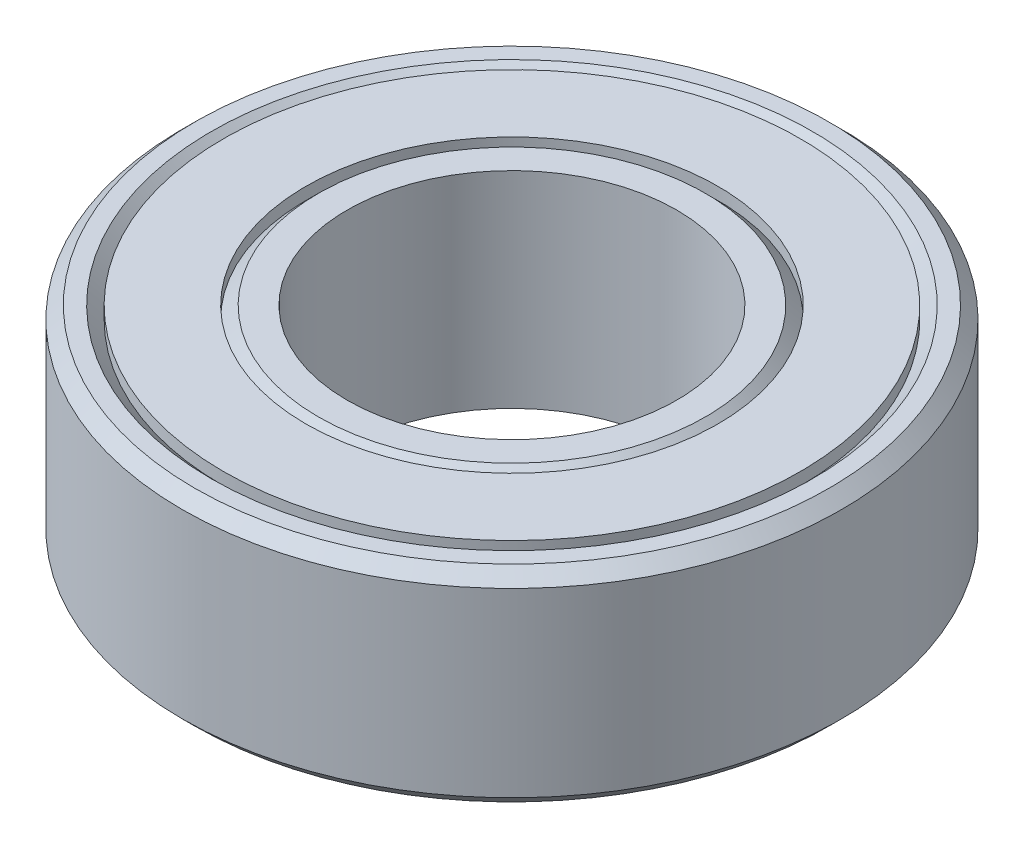
ISO-10303-21;
HEADER;
FILE_DESCRIPTION(('STEP AP214'),'2;1');
FILE_NAME('part.step','',(''),(''),'','','');
FILE_SCHEMA(('AUTOMOTIVE_DESIGN { 1 0 10303 214 1 1 1 1 }'));
ENDSEC;
DATA;
#1=APPLICATION_CONTEXT('core data for automotive mechanical design processes');
#2=APPLICATION_PROTOCOL_DEFINITION('international standard','automotive_design',2000,#1);
#3=PRODUCT_CONTEXT('',#1,'mechanical');
#4=PRODUCT('Part','Part','',(#3));
#5=PRODUCT_RELATED_PRODUCT_CATEGORY('part','',(#4));
#6=PRODUCT_DEFINITION_FORMATION('','',#4);
#7=PRODUCT_DEFINITION_CONTEXT('part definition',#1,'design');
#8=PRODUCT_DEFINITION('design','',#6,#7);
#9=PRODUCT_DEFINITION_SHAPE('','',#8);
#10=(LENGTH_UNIT() NAMED_UNIT(*) SI_UNIT(.MILLI.,.METRE.));
#11=(NAMED_UNIT(*) PLANE_ANGLE_UNIT() SI_UNIT($,.RADIAN.));
#12=(NAMED_UNIT(*) SI_UNIT($,.STERADIAN.) SOLID_ANGLE_UNIT());
#13=UNCERTAINTY_MEASURE_WITH_UNIT(LENGTH_MEASURE(1.E-05),#10,'distance_accuracy_value','');
#14=(GEOMETRIC_REPRESENTATION_CONTEXT(3) GLOBAL_UNCERTAINTY_ASSIGNED_CONTEXT((#13)) GLOBAL_UNIT_ASSIGNED_CONTEXT((#10,
#11,#12)) REPRESENTATION_CONTEXT('',''));
#15=CARTESIAN_POINT('',(0.,0.,0.));
#16=DIRECTION('',(0.,0.,1.));
#17=DIRECTION('',(1.,0.,0.));
#18=AXIS2_PLACEMENT_3D('',#15,#16,#17);
#19=CARTESIAN_POINT('',(0.,5.,0.));
#20=DIRECTION('',(0.,1.,0.));
#21=DIRECTION('',(0.,0.,1.));
#22=AXIS2_PLACEMENT_3D('',#19,#20,#21);
#23=PLANE('',#22);
#24=CARTESIAN_POINT('',(0.,5.,0.));
#25=DIRECTION('',(0.,1.,0.));
#26=DIRECTION('',(0.,0.,1.));
#27=AXIS2_PLACEMENT_3D('',#24,#25,#26);
#28=CIRCLE('',#27,4.7);
#29=CARTESIAN_POINT('',(0.,5.,4.7));
#30=VERTEX_POINT('',#29);
#31=EDGE_CURVE('P0_E10',#30,#30,#28,.T.);
#32=ORIENTED_EDGE('',*,*,#31,.T.);
#33=EDGE_LOOP('',(#32));
#34=FACE_BOUND('',#33,.T.);
#35=CARTESIAN_POINT('',(0.,5.,0.));
#36=DIRECTION('',(0.,1.,0.));
#37=DIRECTION('',(0.,0.,1.));
#38=AXIS2_PLACEMENT_3D('',#35,#36,#37);
#39=CIRCLE('',#38,4.);
#40=CARTESIAN_POINT('',(0.,5.,4.));
#41=VERTEX_POINT('',#40);
#42=EDGE_CURVE('P0_E34',#41,#41,#39,.T.);
#43=ORIENTED_EDGE('',*,*,#42,.F.);
#44=EDGE_LOOP('',(#43));
#45=FACE_BOUND('',#44,.T.);
#46=ADVANCED_FACE('P0_F14',(#34,#45),#23,.T.);
#47=CARTESIAN_POINT('',(0.,0.,0.));
#48=DIRECTION('',(0.,1.,0.));
#49=DIRECTION('',(0.,0.,1.));
#50=AXIS2_PLACEMENT_3D('',#47,#48,#49);
#51=PLANE('',#50);
#52=CARTESIAN_POINT('',(0.,0.,0.));
#53=DIRECTION('',(0.,1.,0.));
#54=DIRECTION('',(0.,0.,1.));
#55=AXIS2_PLACEMENT_3D('',#52,#53,#54);
#56=CIRCLE('',#55,4.7);
#57=CARTESIAN_POINT('',(0.,0.,4.7));
#58=VERTEX_POINT('',#57);
#59=EDGE_CURVE('P0_E21',#58,#58,#56,.F.);
#60=ORIENTED_EDGE('',*,*,#59,.T.);
#61=EDGE_LOOP('',(#60));
#62=FACE_BOUND('',#61,.T.);
#63=CARTESIAN_POINT('',(0.,0.,0.));
#64=DIRECTION('',(0.,1.,0.));
#65=DIRECTION('',(0.,0.,1.));
#66=AXIS2_PLACEMENT_3D('',#63,#64,#65);
#67=CIRCLE('',#66,4.);
#68=CARTESIAN_POINT('',(0.,0.,4.));
#69=VERTEX_POINT('',#68);
#70=EDGE_CURVE('P0_E35',#69,#69,#67,.T.);
#71=ORIENTED_EDGE('',*,*,#70,.T.);
#72=EDGE_LOOP('',(#71));
#73=FACE_BOUND('',#72,.T.);
#74=ADVANCED_FACE('P0_F45',(#62,#73),#51,.F.);
#75=CARTESIAN_POINT('',(0.,5.,0.));
#76=DIRECTION('',(0.,-1.,0.));
#77=DIRECTION('',(0.,0.,-1.));
#78=AXIS2_PLACEMENT_3D('',#75,#76,#77);
#79=CYLINDRICAL_SURFACE('',#78,5.);
#80=CARTESIAN_POINT('',(0.,0.3,0.));
#81=DIRECTION('',(0.,1.,0.));
#82=DIRECTION('',(0.,0.,1.));
#83=AXIS2_PLACEMENT_3D('',#80,#81,#82);
#84=CIRCLE('',#83,5.);
#85=CARTESIAN_POINT('',(0.,0.3,5.));
#86=VERTEX_POINT('',#85);
#87=EDGE_CURVE('P0_E25',#86,#86,#84,.T.);
#88=ORIENTED_EDGE('',*,*,#87,.T.);
#89=EDGE_LOOP('',(#88));
#90=FACE_BOUND('',#89,.T.);
#91=CARTESIAN_POINT('',(0.,4.7,0.));
#92=DIRECTION('',(0.,1.,0.));
#93=DIRECTION('',(0.,0.,1.));
#94=AXIS2_PLACEMENT_3D('',#91,#92,#93);
#95=CIRCLE('',#94,5.);
#96=CARTESIAN_POINT('',(0.,4.7,5.));
#97=VERTEX_POINT('',#96);
#98=EDGE_CURVE('P0_E29',#97,#97,#95,.F.);
#99=ORIENTED_EDGE('',*,*,#98,.T.);
#100=EDGE_LOOP('',(#99));
#101=FACE_BOUND('',#100,.T.);
#102=ADVANCED_FACE('P0_F51',(#90,#101),#79,.T.);
#103=CARTESIAN_POINT('',(0.,5.,0.));
#104=DIRECTION('',(0.,-1.,0.));
#105=DIRECTION('',(0.,0.,-1.));
#106=AXIS2_PLACEMENT_3D('',#103,#104,#105);
#107=CYLINDRICAL_SURFACE('',#106,4.);
#108=ORIENTED_EDGE('',*,*,#42,.T.);
#109=EDGE_LOOP('',(#108));
#110=FACE_BOUND('',#109,.T.);
#111=ORIENTED_EDGE('',*,*,#70,.F.);
#112=EDGE_LOOP('',(#111));
#113=FACE_BOUND('',#112,.T.);
#114=ADVANCED_FACE('P0_F41',(#110,#113),#107,.F.);
#115=CARTESIAN_POINT('',(0.,0.3,0.));
#116=DIRECTION('',(0.,1.,0.));
#117=DIRECTION('',(0.,0.,1.));
#118=AXIS2_PLACEMENT_3D('',#115,#116,#117);
#119=CONICAL_SURFACE('',#118,5.,0.78539816339745);
#120=ORIENTED_EDGE('',*,*,#59,.F.);
#121=EDGE_LOOP('',(#120));
#122=FACE_BOUND('',#121,.T.);
#123=ORIENTED_EDGE('',*,*,#87,.F.);
#124=EDGE_LOOP('',(#123));
#125=FACE_BOUND('',#124,.T.);
#126=ADVANCED_FACE('P0_F57',(#122,#125),#119,.T.);
#127=CARTESIAN_POINT('',(0.,5.,0.));
#128=DIRECTION('',(0.,-1.,0.));
#129=DIRECTION('',(0.,0.,-1.));
#130=AXIS2_PLACEMENT_3D('',#127,#128,#129);
#131=CONICAL_SURFACE('',#130,4.7,0.78539816339745);
#132=ORIENTED_EDGE('',*,*,#98,.F.);
#133=EDGE_LOOP('',(#132));
#134=FACE_BOUND('',#133,.T.);
#135=ORIENTED_EDGE('',*,*,#31,.F.);
#136=EDGE_LOOP('',(#135));
#137=FACE_BOUND('',#136,.T.);
#138=ADVANCED_FACE('P0_F16',(#134,#137),#131,.T.);
#139=CLOSED_SHELL('',(#46,#74,#102,#114,#126,#138));
#140=MANIFOLD_SOLID_BREP('P0_B1',#139);
#141=CARTESIAN_POINT('',(0.,5.,0.));
#142=DIRECTION('',(0.,1.,0.));
#143=DIRECTION('',(0.,0.,1.));
#144=AXIS2_PLACEMENT_3D('',#141,#142,#143);
#145=PLANE('',#144);
#146=CARTESIAN_POINT('',(0.,5.,0.));
#147=DIRECTION('',(0.,1.,0.));
#148=DIRECTION('',(0.,0.,1.));
#149=AXIS2_PLACEMENT_3D('',#146,#147,#148);
#150=CIRCLE('',#149,7.3);
#151=CARTESIAN_POINT('',(0.,5.,7.3));
#152=VERTEX_POINT('',#151);
#153=EDGE_CURVE('P1_E25',#152,#152,#150,.F.);
#154=ORIENTED_EDGE('',*,*,#153,.T.);
#155=EDGE_LOOP('',(#154));
#156=FACE_BOUND('',#155,.T.);
#157=CARTESIAN_POINT('',(0.,5.,0.));
#158=DIRECTION('',(0.,1.,0.));
#159=DIRECTION('',(0.,0.,1.));
#160=AXIS2_PLACEMENT_3D('',#157,#158,#159);
#161=CIRCLE('',#160,7.70000000000001);
#162=CARTESIAN_POINT('',(0.,5.,7.70000000000001));
#163=VERTEX_POINT('',#162);
#164=EDGE_CURVE('P1_E29',#163,#163,#161,.T.);
#165=ORIENTED_EDGE('',*,*,#164,.T.);
#166=EDGE_LOOP('',(#165));
#167=FACE_BOUND('',#166,.T.);
#168=ADVANCED_FACE('P1_F14',(#156,#167),#145,.T.);
#169=CARTESIAN_POINT('',(0.,0.,0.));
#170=DIRECTION('',(0.,1.,0.));
#171=DIRECTION('',(0.,0.,1.));
#172=AXIS2_PLACEMENT_3D('',#169,#170,#171);
#173=PLANE('',#172);
#174=CARTESIAN_POINT('',(0.,0.,0.));
#175=DIRECTION('',(0.,1.,0.));
#176=DIRECTION('',(0.,0.,1.));
#177=AXIS2_PLACEMENT_3D('',#174,#175,#176);
#178=CIRCLE('',#177,7.3);
#179=CARTESIAN_POINT('',(0.,0.,-7.3));
#180=VERTEX_POINT('',#179);
#181=EDGE_CURVE('P1_E40',#180,#180,#178,.T.);
#182=ORIENTED_EDGE('',*,*,#181,.T.);
#183=EDGE_LOOP('',(#182));
#184=FACE_BOUND('',#183,.T.);
#185=CARTESIAN_POINT('',(0.,0.,0.));
#186=DIRECTION('',(0.,1.,0.));
#187=DIRECTION('',(0.,0.,1.));
#188=AXIS2_PLACEMENT_3D('',#185,#186,#187);
#189=CIRCLE('',#188,7.7);
#190=CARTESIAN_POINT('',(0.,0.,7.7));
#191=VERTEX_POINT('',#190);
#192=EDGE_CURVE('P1_E43',#191,#191,#189,.F.);
#193=ORIENTED_EDGE('',*,*,#192,.T.);
#194=EDGE_LOOP('',(#193));
#195=FACE_BOUND('',#194,.T.);
#196=ADVANCED_FACE('P1_F47',(#184,#195),#173,.F.);
#197=CARTESIAN_POINT('',(0.,5.,0.));
#198=DIRECTION('',(0.,-1.,0.));
#199=DIRECTION('',(0.,0.,-1.));
#200=AXIS2_PLACEMENT_3D('',#197,#198,#199);
#201=CYLINDRICAL_SURFACE('',#200,8.);
#202=CARTESIAN_POINT('',(0.,0.300000000000002,0.));
#203=DIRECTION('',(0.,1.,0.));
#204=DIRECTION('',(0.,0.,1.));
#205=AXIS2_PLACEMENT_3D('',#202,#203,#204);
#206=CIRCLE('',#205,8.);
#207=CARTESIAN_POINT('',(0.,0.300000000000002,8.));
#208=VERTEX_POINT('',#207);
#209=EDGE_CURVE('P1_E10',#208,#208,#206,.T.);
#210=ORIENTED_EDGE('',*,*,#209,.T.);
#211=EDGE_LOOP('',(#210));
#212=FACE_BOUND('',#211,.T.);
#213=CARTESIAN_POINT('',(0.,4.7,0.));
#214=DIRECTION('',(0.,1.,0.));
#215=DIRECTION('',(0.,0.,1.));
#216=AXIS2_PLACEMENT_3D('',#213,#214,#215);
#217=CIRCLE('',#216,8.);
#218=CARTESIAN_POINT('',(0.,4.7,8.));
#219=VERTEX_POINT('',#218);
#220=EDGE_CURVE('P1_E21',#219,#219,#217,.F.);
#221=ORIENTED_EDGE('',*,*,#220,.T.);
#222=EDGE_LOOP('',(#221));
#223=FACE_BOUND('',#222,.T.);
#224=ADVANCED_FACE('P1_F68',(#212,#223),#201,.T.);
#225=CARTESIAN_POINT('',(0.,5.,0.));
#226=DIRECTION('',(0.,-1.,0.));
#227=DIRECTION('',(0.,0.,-1.));
#228=AXIS2_PLACEMENT_3D('',#225,#226,#227);
#229=CYLINDRICAL_SURFACE('',#228,7.);
#230=CARTESIAN_POINT('',(0.,0.300000000000005,0.));
#231=DIRECTION('',(0.,1.,0.));
#232=DIRECTION('',(0.,0.,1.));
#233=AXIS2_PLACEMENT_3D('',#230,#231,#232);
#234=CIRCLE('',#233,7.);
#235=CARTESIAN_POINT('',(0.,0.300000000000005,-7.));
#236=VERTEX_POINT('',#235);
#237=EDGE_CURVE('P1_E34',#236,#236,#234,.F.);
#238=ORIENTED_EDGE('',*,*,#237,.T.);
#239=EDGE_LOOP('',(#238));
#240=FACE_BOUND('',#239,.T.);
#241=CARTESIAN_POINT('',(0.,4.7,0.));
#242=DIRECTION('',(0.,1.,0.));
#243=DIRECTION('',(0.,0.,1.));
#244=AXIS2_PLACEMENT_3D('',#241,#242,#243);
#245=CIRCLE('',#244,7.);
#246=CARTESIAN_POINT('',(0.,4.7,7.));
#247=VERTEX_POINT('',#246);
#248=EDGE_CURVE('P1_E37',#247,#247,#245,.T.);
#249=ORIENTED_EDGE('',*,*,#248,.T.);
#250=EDGE_LOOP('',(#249));
#251=FACE_BOUND('',#250,.T.);
#252=ADVANCED_FACE('P1_F73',(#240,#251),#229,.F.);
#253=CARTESIAN_POINT('',(0.,0.,0.));
#254=DIRECTION('',(0.,-1.,0.));
#255=DIRECTION('',(0.,0.,-1.));
#256=AXIS2_PLACEMENT_3D('',#253,#254,#255);
#257=CONICAL_SURFACE('',#256,7.3,0.785398163397444);
#258=CARTESIAN_POINT('',(0.,0.300000000000005,-7.));
#259=CARTESIAN_POINT('',(0.,0.296875000000005,-7.003125));
#260=CARTESIAN_POINT('',(0.,0.293750000000005,-7.00625));
#261=CARTESIAN_POINT('',(0.,0.287500000000005,-7.0125));
#262=CARTESIAN_POINT('',(0.,0.284375000000005,-7.015625));
#263=CARTESIAN_POINT('',(0.,0.278125000000005,-7.021875));
#264=CARTESIAN_POINT('',(0.,0.275000000000005,-7.025));
#265=CARTESIAN_POINT('',(0.,0.268750000000004,-7.03125));
#266=CARTESIAN_POINT('',(0.,0.265625000000004,-7.034375));
#267=CARTESIAN_POINT('',(0.,0.259375000000004,-7.040625));
#268=CARTESIAN_POINT('',(0.,0.256250000000004,-7.04375));
#269=CARTESIAN_POINT('',(0.,0.250000000000004,-7.05));
#270=CARTESIAN_POINT('',(0.,0.246875000000004,-7.053125));
#271=CARTESIAN_POINT('',(0.,0.240625000000004,-7.059375));
#272=CARTESIAN_POINT('',(0.,0.237500000000004,-7.0625));
#273=CARTESIAN_POINT('',(0.,0.231250000000004,-7.06875));
#274=CARTESIAN_POINT('',(0.,0.228125000000004,-7.071875));
#275=CARTESIAN_POINT('',(0.,0.221875000000004,-7.078125));
#276=CARTESIAN_POINT('',(0.,0.218750000000004,-7.08125));
#277=CARTESIAN_POINT('',(0.,0.212500000000004,-7.0875));
#278=CARTESIAN_POINT('',(0.,0.209375000000004,-7.090625));
#279=CARTESIAN_POINT('',(0.,0.203125000000003,-7.096875));
#280=CARTESIAN_POINT('',(0.,0.200000000000003,-7.1));
#281=CARTESIAN_POINT('',(0.,0.193750000000003,-7.10625));
#282=CARTESIAN_POINT('',(0.,0.190625000000003,-7.109375));
#283=CARTESIAN_POINT('',(0.,0.184375000000003,-7.115625));
#284=CARTESIAN_POINT('',(0.,0.181250000000003,-7.11875));
#285=CARTESIAN_POINT('',(0.,0.175000000000003,-7.125));
#286=CARTESIAN_POINT('',(0.,0.171875000000003,-7.128125));
#287=CARTESIAN_POINT('',(0.,0.165625000000003,-7.134375));
#288=CARTESIAN_POINT('',(0.,0.162500000000003,-7.1375));
#289=CARTESIAN_POINT('',(0.,0.156250000000003,-7.14375));
#290=CARTESIAN_POINT('',(0.,0.153125000000003,-7.146875));
#291=CARTESIAN_POINT('',(0.,0.146875000000003,-7.153125));
#292=CARTESIAN_POINT('',(0.,0.143750000000002,-7.15625));
#293=CARTESIAN_POINT('',(0.,0.137500000000002,-7.1625));
#294=CARTESIAN_POINT('',(0.,0.134375000000002,-7.165625));
#295=CARTESIAN_POINT('',(0.,0.128125000000002,-7.171875));
#296=CARTESIAN_POINT('',(0.,0.125000000000002,-7.175));
#297=CARTESIAN_POINT('',(0.,0.118750000000002,-7.18125));
#298=CARTESIAN_POINT('',(0.,0.115625000000002,-7.184375));
#299=CARTESIAN_POINT('',(0.,0.109375000000002,-7.190625));
#300=CARTESIAN_POINT('',(0.,0.106250000000002,-7.19375));
#301=CARTESIAN_POINT('',(0.,0.100000000000002,-7.2));
#302=CARTESIAN_POINT('',(0.,0.0968750000000017,-7.203125));
#303=CARTESIAN_POINT('',(0.,0.0906250000000015,-7.209375));
#304=CARTESIAN_POINT('',(0.,0.0875000000000014,-7.2125));
#305=CARTESIAN_POINT('',(0.,0.0812500000000013,-7.21875));
#306=CARTESIAN_POINT('',(0.,0.0781250000000014,-7.221875));
#307=CARTESIAN_POINT('',(0.,0.0718750000000013,-7.228125));
#308=CARTESIAN_POINT('',(0.,0.0687500000000012,-7.23125));
#309=CARTESIAN_POINT('',(0.,0.062500000000001,-7.2375));
#310=CARTESIAN_POINT('',(0.,0.0593750000000009,-7.240625));
#311=CARTESIAN_POINT('',(0.,0.0531250000000009,-7.246875));
#312=CARTESIAN_POINT('',(0.,0.0500000000000009,-7.25));
#313=CARTESIAN_POINT('',(0.,0.0437500000000008,-7.25625));
#314=CARTESIAN_POINT('',(0.,0.0406250000000007,-7.259375));
#315=CARTESIAN_POINT('',(0.,0.0343750000000006,-7.265625));
#316=CARTESIAN_POINT('',(0.,0.0312500000000005,-7.26875));
#317=CARTESIAN_POINT('',(0.,0.0250000000000004,-7.275));
#318=CARTESIAN_POINT('',(0.,0.0218750000000003,-7.278125));
#319=CARTESIAN_POINT('',(0.,0.0156250000000002,-7.284375));
#320=CARTESIAN_POINT('',(0.,0.0125000000000002,-7.2875));
#321=CARTESIAN_POINT('',(0.,0.00625000000000024,-7.29375));
#322=CARTESIAN_POINT('',(0.,0.00312500000000026,-7.296875));
#323=CARTESIAN_POINT('',(0.,0.,-7.3));
#324=B_SPLINE_CURVE_WITH_KNOTS('',3,(#258,#259,#260,#261,#262,#263,#264,#265,#266,#267,#268,
#269,#270,#271,#272,#273,#274,#275,#276,#277,#278,#279,#280,#281,#282,#283,#284,#285,#286,#287,
#288,#289,#290,#291,#292,#293,#294,#295,#296,#297,#298,#299,#300,#301,#302,#303,#304,#305,#306,
#307,#308,#309,#310,#311,#312,#313,#314,#315,#316,#317,#318,#319,#320,#321,#322,#323),
.UNSPECIFIED.,.F.,.F.,(4,2,2,2,2,2,2,2,2,2,2,2,2,2,2,2,2,2,2,2,2,2,2,2,2,2,2,2,2,2,2,2,4),(0.,
0.0132582521472478,0.0265165042944961,0.0397747564417439,0.0530330085889917,0.0662912607362394,
0.0795495128834878,0.0928077650307355,0.106066017177983,0.119324269325232,0.132582521472479,
0.145840773619727,0.159099025766975,0.172357277914223,0.185615530061471,0.198873782208719,
0.212132034355967,0.225390286503215,0.238648538650463,0.251906790797711,0.265165042944959,
0.278423295092207,0.291681547239454,0.304939799386702,0.318198051533951,0.331456303681198,
0.344714555828446,0.357972807975695,0.371231060122942,0.38448931227019,0.397747564417438,
0.411005816564686,0.424264068711934),.UNSPECIFIED.);
#325=EDGE_CURVE('P1_BSEAM59',#236,#180,#324,.T.);
#326=ORIENTED_EDGE('',*,*,#237,.F.);
#327=ORIENTED_EDGE('',*,*,#181,.F.);
#328=ORIENTED_EDGE('',*,*,#325,.T.);
#329=ORIENTED_EDGE('',*,*,#325,.F.);
#330=EDGE_LOOP('',(#326,#328,#327,#329));
#331=FACE_BOUND('',#330,.T.);
#332=ADVANCED_FACE('P1_F59',(#331),#257,.F.);
#333=CARTESIAN_POINT('',(0.,4.7,0.));
#334=DIRECTION('',(0.,1.,0.));
#335=DIRECTION('',(0.,0.,1.));
#336=AXIS2_PLACEMENT_3D('',#333,#334,#335);
#337=CONICAL_SURFACE('',#336,7.,0.785398163397453);
#338=ORIENTED_EDGE('',*,*,#153,.F.);
#339=EDGE_LOOP('',(#338));
#340=FACE_BOUND('',#339,.T.);
#341=ORIENTED_EDGE('',*,*,#248,.F.);
#342=EDGE_LOOP('',(#341));
#343=FACE_BOUND('',#342,.T.);
#344=ADVANCED_FACE('P1_F52',(#340,#343),#337,.F.);
#345=CARTESIAN_POINT('',(0.,0.300000000000002,0.));
#346=DIRECTION('',(0.,1.,0.));
#347=DIRECTION('',(0.,0.,1.));
#348=AXIS2_PLACEMENT_3D('',#345,#346,#347);
#349=CONICAL_SURFACE('',#348,8.,0.785398163397445);
#350=ORIENTED_EDGE('',*,*,#192,.F.);
#351=EDGE_LOOP('',(#350));
#352=FACE_BOUND('',#351,.T.);
#353=ORIENTED_EDGE('',*,*,#209,.F.);
#354=EDGE_LOOP('',(#353));
#355=FACE_BOUND('',#354,.T.);
#356=ADVANCED_FACE('P1_F49',(#352,#355),#349,.T.);
#357=CARTESIAN_POINT('',(0.,5.,0.));
#358=DIRECTION('',(0.,-1.,0.));
#359=DIRECTION('',(0.,0.,-1.));
#360=AXIS2_PLACEMENT_3D('',#357,#358,#359);
#361=CONICAL_SURFACE('',#360,7.70000000000001,0.78539816339744);
#362=ORIENTED_EDGE('',*,*,#220,.F.);
#363=EDGE_LOOP('',(#362));
#364=FACE_BOUND('',#363,.T.);
#365=ORIENTED_EDGE('',*,*,#164,.F.);
#366=EDGE_LOOP('',(#365));
#367=FACE_BOUND('',#366,.T.);
#368=ADVANCED_FACE('P1_F16',(#364,#367),#361,.T.);
#369=CLOSED_SHELL('',(#168,#196,#224,#252,#332,#344,#356,#368));
#370=MANIFOLD_SOLID_BREP('P1_B1',#369);
#371=CARTESIAN_POINT('',(0.,5.,0.));
#372=DIRECTION('',(0.,1.,0.));
#373=DIRECTION('',(0.,0.,1.));
#374=AXIS2_PLACEMENT_3D('',#371,#372,#373);
#375=PLANE('',#374);
#376=CARTESIAN_POINT('',(0.,5.,0.));
#377=DIRECTION('',(0.,1.,0.));
#378=DIRECTION('',(0.,0.,1.));
#379=AXIS2_PLACEMENT_3D('',#376,#377,#378);
#380=CIRCLE('',#379,7.);
#381=CARTESIAN_POINT('',(0.,5.,7.));
#382=VERTEX_POINT('',#381);
#383=EDGE_CURVE('P2_E10',#382,#382,#380,.T.);
#384=ORIENTED_EDGE('',*,*,#383,.T.);
#385=EDGE_LOOP('',(#384));
#386=FACE_BOUND('',#385,.T.);
#387=CARTESIAN_POINT('',(0.,5.,0.));
#388=DIRECTION('',(0.,1.,0.));
#389=DIRECTION('',(0.,0.,1.));
#390=AXIS2_PLACEMENT_3D('',#387,#388,#389);
#391=CIRCLE('',#390,5.);
#392=CARTESIAN_POINT('',(0.,5.,5.));
#393=VERTEX_POINT('',#392);
#394=EDGE_CURVE('P2_E25',#393,#393,#391,.T.);
#395=ORIENTED_EDGE('',*,*,#394,.F.);
#396=EDGE_LOOP('',(#395));
#397=FACE_BOUND('',#396,.T.);
#398=ADVANCED_FACE('P2_F14',(#386,#397),#375,.T.);
#399=CARTESIAN_POINT('',(0.,0.,0.));
#400=DIRECTION('',(0.,1.,0.));
#401=DIRECTION('',(0.,0.,1.));
#402=AXIS2_PLACEMENT_3D('',#399,#400,#401);
#403=PLANE('',#402);
#404=CARTESIAN_POINT('',(0.,0.,0.));
#405=DIRECTION('',(0.,1.,0.));
#406=DIRECTION('',(0.,0.,1.));
#407=AXIS2_PLACEMENT_3D('',#404,#405,#406);
#408=CIRCLE('',#407,7.);
#409=CARTESIAN_POINT('',(0.,0.,7.));
#410=VERTEX_POINT('',#409);
#411=EDGE_CURVE('P2_E18',#410,#410,#408,.T.);
#412=ORIENTED_EDGE('',*,*,#411,.F.);
#413=EDGE_LOOP('',(#412));
#414=FACE_BOUND('',#413,.T.);
#415=CARTESIAN_POINT('',(0.,0.,0.));
#416=DIRECTION('',(0.,1.,0.));
#417=DIRECTION('',(0.,0.,1.));
#418=AXIS2_PLACEMENT_3D('',#415,#416,#417);
#419=CIRCLE('',#418,5.);
#420=CARTESIAN_POINT('',(0.,0.,5.));
#421=VERTEX_POINT('',#420);
#422=EDGE_CURVE('P2_E27',#421,#421,#419,.T.);
#423=ORIENTED_EDGE('',*,*,#422,.T.);
#424=EDGE_LOOP('',(#423));
#425=FACE_BOUND('',#424,.T.);
#426=ADVANCED_FACE('P2_F37',(#414,#425),#403,.F.);
#427=CARTESIAN_POINT('',(0.,5.,0.));
#428=DIRECTION('',(0.,-1.,0.));
#429=DIRECTION('',(0.,0.,-1.));
#430=AXIS2_PLACEMENT_3D('',#427,#428,#429);
#431=CYLINDRICAL_SURFACE('',#430,7.);
#432=ORIENTED_EDGE('',*,*,#383,.F.);
#433=EDGE_LOOP('',(#432));
#434=FACE_BOUND('',#433,.T.);
#435=ORIENTED_EDGE('',*,*,#411,.T.);
#436=EDGE_LOOP('',(#435));
#437=FACE_BOUND('',#436,.T.);
#438=ADVANCED_FACE('P2_F16',(#434,#437),#431,.T.);
#439=CARTESIAN_POINT('',(0.,5.,0.));
#440=DIRECTION('',(0.,-1.,0.));
#441=DIRECTION('',(0.,0.,-1.));
#442=AXIS2_PLACEMENT_3D('',#439,#440,#441);
#443=CYLINDRICAL_SURFACE('',#442,5.);
#444=ORIENTED_EDGE('',*,*,#394,.T.);
#445=EDGE_LOOP('',(#444));
#446=FACE_BOUND('',#445,.T.);
#447=ORIENTED_EDGE('',*,*,#422,.F.);
#448=EDGE_LOOP('',(#447));
#449=FACE_BOUND('',#448,.T.);
#450=ADVANCED_FACE('P2_F33',(#446,#449),#443,.F.);
#451=CLOSED_SHELL('',(#398,#426,#438,#450));
#452=MANIFOLD_SOLID_BREP('P2_B1',#451);
#453=ADVANCED_BREP_SHAPE_REPRESENTATION('',(#18,#140,#370,#452),#14);
#454=SHAPE_DEFINITION_REPRESENTATION(#9,#453);
ENDSEC;
END-ISO-10303-21;
